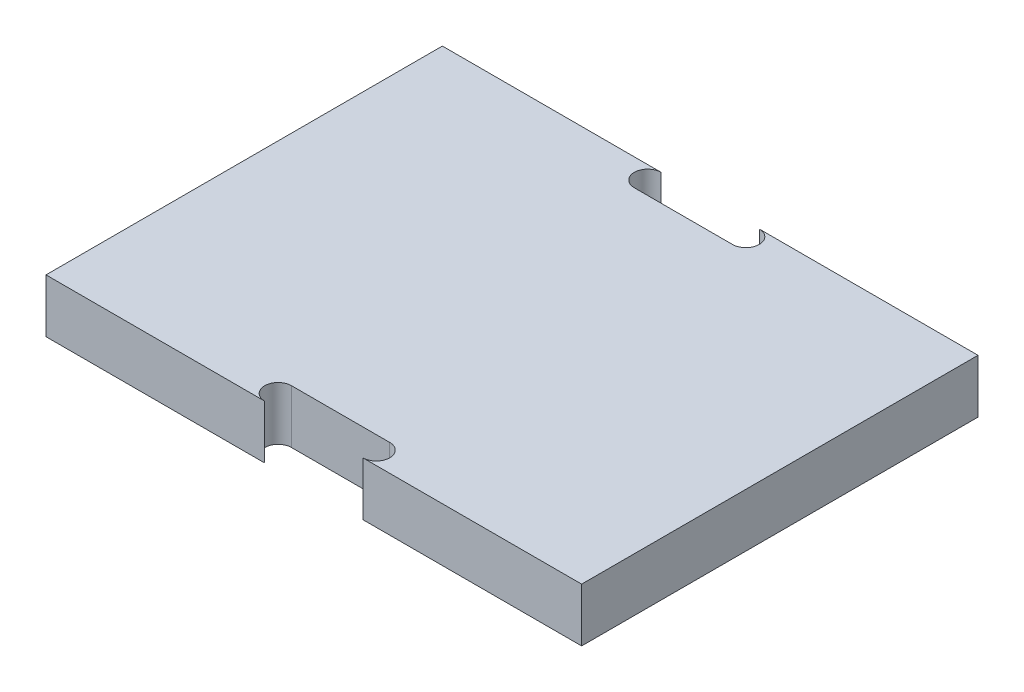
ISO-10303-21;
HEADER;
FILE_DESCRIPTION(('STEP AP214'),'2;1');
FILE_NAME('part.step','',(''),(''),'','','');
FILE_SCHEMA(('AUTOMOTIVE_DESIGN { 1 0 10303 214 1 1 1 1 }'));
ENDSEC;
DATA;
#1=APPLICATION_CONTEXT('core data for automotive mechanical design processes');
#2=APPLICATION_PROTOCOL_DEFINITION('international standard','automotive_design',2000,#1);
#3=PRODUCT_CONTEXT('',#1,'mechanical');
#4=PRODUCT('Part','Part','',(#3));
#5=PRODUCT_RELATED_PRODUCT_CATEGORY('part','',(#4));
#6=PRODUCT_DEFINITION_FORMATION('','',#4);
#7=PRODUCT_DEFINITION_CONTEXT('part definition',#1,'design');
#8=PRODUCT_DEFINITION('design','',#6,#7);
#9=PRODUCT_DEFINITION_SHAPE('','',#8);
#10=(LENGTH_UNIT() NAMED_UNIT(*) SI_UNIT(.MILLI.,.METRE.));
#11=(NAMED_UNIT(*) PLANE_ANGLE_UNIT() SI_UNIT($,.RADIAN.));
#12=(NAMED_UNIT(*) SI_UNIT($,.STERADIAN.) SOLID_ANGLE_UNIT());
#13=UNCERTAINTY_MEASURE_WITH_UNIT(LENGTH_MEASURE(1.E-05),#10,'distance_accuracy_value','');
#14=(GEOMETRIC_REPRESENTATION_CONTEXT(3) GLOBAL_UNCERTAINTY_ASSIGNED_CONTEXT((#13)) GLOBAL_UNIT_ASSIGNED_CONTEXT((#10,
#11,#12)) REPRESENTATION_CONTEXT('',''));
#15=CARTESIAN_POINT('',(0.,0.,0.));
#16=DIRECTION('',(0.,0.,1.));
#17=DIRECTION('',(1.,0.,0.));
#18=AXIS2_PLACEMENT_3D('',#15,#16,#17);
#19=CARTESIAN_POINT('',(-30.,6.,22.2));
#20=DIRECTION('',(0.,0.,-1.));
#21=DIRECTION('',(-1.,0.,0.));
#22=AXIS2_PLACEMENT_3D('',#19,#20,#21);
#23=PLANE('',#22);
#24=DIRECTION('',(1.,0.,0.));
#25=VECTOR('',#24,1.);
#26=CARTESIAN_POINT('',(-30.,0.,22.2));
#27=LINE('',#26,#25);
#28=CARTESIAN_POINT('',(-30.,0.,22.2));
#29=VERTEX_POINT('',#28);
#30=CARTESIAN_POINT('',(-5.5,0.,22.2));
#31=VERTEX_POINT('',#30);
#32=EDGE_CURVE('E171',#29,#31,#27,.T.);
#33=ORIENTED_EDGE('',*,*,#32,.T.);
#34=DIRECTION('',(0.,-1.,0.));
#35=VECTOR('',#34,1.);
#36=CARTESIAN_POINT('',(-5.5,6.,22.2));
#37=LINE('',#36,#35);
#38=CARTESIAN_POINT('',(-5.5,6.,22.2));
#39=VERTEX_POINT('',#38);
#40=EDGE_CURVE('E52',#39,#31,#37,.T.);
#41=ORIENTED_EDGE('',*,*,#40,.F.);
#42=DIRECTION('',(1.,0.,0.));
#43=VECTOR('',#42,1.);
#44=CARTESIAN_POINT('',(-30.,6.,22.2));
#45=LINE('',#44,#43);
#46=CARTESIAN_POINT('',(-30.,6.,22.2));
#47=VERTEX_POINT('',#46);
#48=EDGE_CURVE('E116',#47,#39,#45,.T.);
#49=ORIENTED_EDGE('',*,*,#48,.F.);
#50=DIRECTION('',(0.,-1.,0.));
#51=VECTOR('',#50,1.);
#52=CARTESIAN_POINT('',(-30.,6.,22.2));
#53=LINE('',#52,#51);
#54=EDGE_CURVE('E11',#47,#29,#53,.T.);
#55=ORIENTED_EDGE('',*,*,#54,.T.);
#56=EDGE_LOOP('',(#33,#41,#49,#55));
#57=FACE_BOUND('',#56,.T.);
#58=ADVANCED_FACE('F43',(#57),#23,.F.);
#59=CARTESIAN_POINT('',(-5.5,6.,20.7));
#60=DIRECTION('',(0.,-1.,0.));
#61=DIRECTION('',(0.,0.,-1.));
#62=AXIS2_PLACEMENT_3D('',#59,#60,#61);
#63=CYLINDRICAL_SURFACE('',#62,1.5);
#64=CARTESIAN_POINT('',(-5.5,0.,20.7));
#65=DIRECTION('',(0.,-1.,0.));
#66=DIRECTION('',(0.,0.,1.));
#67=AXIS2_PLACEMENT_3D('',#64,#65,#66);
#68=CIRCLE('',#67,1.5);
#69=CARTESIAN_POINT('',(-5.5,0.,19.2));
#70=VERTEX_POINT('',#69);
#71=EDGE_CURVE('E174',#31,#70,#68,.T.);
#72=ORIENTED_EDGE('',*,*,#71,.T.);
#73=DIRECTION('',(0.,-1.,0.));
#74=VECTOR('',#73,1.);
#75=CARTESIAN_POINT('',(-5.5,6.,19.2));
#76=LINE('',#75,#74);
#77=CARTESIAN_POINT('',(-5.5,6.,19.2));
#78=VERTEX_POINT('',#77);
#79=EDGE_CURVE('E233',#78,#70,#76,.T.);
#80=ORIENTED_EDGE('',*,*,#79,.F.);
#81=CARTESIAN_POINT('',(-5.5,6.,20.7));
#82=DIRECTION('',(0.,-1.,0.));
#83=DIRECTION('',(0.,0.,1.));
#84=AXIS2_PLACEMENT_3D('',#81,#82,#83);
#85=CIRCLE('',#84,1.5);
#86=EDGE_CURVE('E243',#39,#78,#85,.T.);
#87=ORIENTED_EDGE('',*,*,#86,.F.);
#88=ORIENTED_EDGE('',*,*,#40,.T.);
#89=EDGE_LOOP('',(#72,#80,#87,#88));
#90=FACE_BOUND('',#89,.T.);
#91=ADVANCED_FACE('F241',(#90),#63,.F.);
#92=CARTESIAN_POINT('',(0.,6.,19.2));
#93=DIRECTION('',(0.,0.,-1.));
#94=DIRECTION('',(-1.,0.,0.));
#95=AXIS2_PLACEMENT_3D('',#92,#93,#94);
#96=PLANE('',#95);
#97=DIRECTION('',(1.,0.,0.));
#98=VECTOR('',#97,1.);
#99=CARTESIAN_POINT('',(0.,0.,19.2));
#100=LINE('',#99,#98);
#101=CARTESIAN_POINT('',(5.5,0.,19.2));
#102=VERTEX_POINT('',#101);
#103=EDGE_CURVE('E178',#70,#102,#100,.T.);
#104=ORIENTED_EDGE('',*,*,#103,.T.);
#105=DIRECTION('',(0.,-1.,0.));
#106=VECTOR('',#105,1.);
#107=CARTESIAN_POINT('',(5.5,6.,19.2));
#108=LINE('',#107,#106);
#109=CARTESIAN_POINT('',(5.5,6.,19.2));
#110=VERTEX_POINT('',#109);
#111=EDGE_CURVE('E229',#110,#102,#108,.T.);
#112=ORIENTED_EDGE('',*,*,#111,.F.);
#113=DIRECTION('',(1.,0.,0.));
#114=VECTOR('',#113,1.);
#115=CARTESIAN_POINT('',(0.,6.,19.2));
#116=LINE('',#115,#114);
#117=EDGE_CURVE('E262',#78,#110,#116,.T.);
#118=ORIENTED_EDGE('',*,*,#117,.F.);
#119=ORIENTED_EDGE('',*,*,#79,.T.);
#120=EDGE_LOOP('',(#104,#112,#118,#119));
#121=FACE_BOUND('',#120,.T.);
#122=ADVANCED_FACE('F252',(#121),#96,.F.);
#123=CARTESIAN_POINT('',(5.5,6.,20.7));
#124=DIRECTION('',(0.,-1.,0.));
#125=DIRECTION('',(0.,0.,-1.));
#126=AXIS2_PLACEMENT_3D('',#123,#124,#125);
#127=CYLINDRICAL_SURFACE('',#126,1.5);
#128=CARTESIAN_POINT('',(5.5,0.,20.7));
#129=DIRECTION('',(0.,-1.,0.));
#130=DIRECTION('',(0.,0.,-1.));
#131=AXIS2_PLACEMENT_3D('',#128,#129,#130);
#132=CIRCLE('',#131,1.5);
#133=CARTESIAN_POINT('',(5.5,0.,22.2));
#134=VERTEX_POINT('',#133);
#135=EDGE_CURVE('E181',#102,#134,#132,.T.);
#136=ORIENTED_EDGE('',*,*,#135,.T.);
#137=DIRECTION('',(0.,-1.,0.));
#138=VECTOR('',#137,1.);
#139=CARTESIAN_POINT('',(5.5,6.,22.2));
#140=LINE('',#139,#138);
#141=CARTESIAN_POINT('',(5.5,6.,22.2));
#142=VERTEX_POINT('',#141);
#143=EDGE_CURVE('E225',#142,#134,#140,.T.);
#144=ORIENTED_EDGE('',*,*,#143,.F.);
#145=CARTESIAN_POINT('',(5.5,6.,20.7));
#146=DIRECTION('',(0.,-1.,0.));
#147=DIRECTION('',(0.,0.,-1.));
#148=AXIS2_PLACEMENT_3D('',#145,#146,#147);
#149=CIRCLE('',#148,1.5);
#150=EDGE_CURVE('E258',#110,#142,#149,.T.);
#151=ORIENTED_EDGE('',*,*,#150,.F.);
#152=ORIENTED_EDGE('',*,*,#111,.T.);
#153=EDGE_LOOP('',(#136,#144,#151,#152));
#154=FACE_BOUND('',#153,.T.);
#155=ADVANCED_FACE('F256',(#154),#127,.F.);
#156=CARTESIAN_POINT('',(30.,6.,22.2));
#157=DIRECTION('',(0.,0.,-1.));
#158=DIRECTION('',(-1.,0.,0.));
#159=AXIS2_PLACEMENT_3D('',#156,#157,#158);
#160=PLANE('',#159);
#161=DIRECTION('',(1.,0.,0.));
#162=VECTOR('',#161,1.);
#163=CARTESIAN_POINT('',(30.,0.,22.2));
#164=LINE('',#163,#162);
#165=CARTESIAN_POINT('',(30.,0.,22.2));
#166=VERTEX_POINT('',#165);
#167=EDGE_CURVE('E184',#134,#166,#164,.T.);
#168=ORIENTED_EDGE('',*,*,#167,.T.);
#169=DIRECTION('',(0.,-1.,0.));
#170=VECTOR('',#169,1.);
#171=CARTESIAN_POINT('',(30.,6.,22.2));
#172=LINE('',#171,#170);
#173=CARTESIAN_POINT('',(30.,6.,22.2));
#174=VERTEX_POINT('',#173);
#175=EDGE_CURVE('E221',#174,#166,#172,.T.);
#176=ORIENTED_EDGE('',*,*,#175,.F.);
#177=DIRECTION('',(1.,0.,0.));
#178=VECTOR('',#177,1.);
#179=CARTESIAN_POINT('',(30.,6.,22.2));
#180=LINE('',#179,#178);
#181=EDGE_CURVE('E261',#142,#174,#180,.T.);
#182=ORIENTED_EDGE('',*,*,#181,.F.);
#183=ORIENTED_EDGE('',*,*,#143,.T.);
#184=EDGE_LOOP('',(#168,#176,#182,#183));
#185=FACE_BOUND('',#184,.T.);
#186=ADVANCED_FACE('F312',(#185),#160,.F.);
#187=CARTESIAN_POINT('',(30.,6.,0.));
#188=DIRECTION('',(-1.,0.,0.));
#189=DIRECTION('',(0.,0.,1.));
#190=AXIS2_PLACEMENT_3D('',#187,#188,#189);
#191=PLANE('',#190);
#192=DIRECTION('',(0.,0.,-1.));
#193=VECTOR('',#192,1.);
#194=CARTESIAN_POINT('',(30.,0.,0.));
#195=LINE('',#194,#193);
#196=CARTESIAN_POINT('',(30.,0.,-22.2));
#197=VERTEX_POINT('',#196);
#198=EDGE_CURVE('E188',#166,#197,#195,.T.);
#199=ORIENTED_EDGE('',*,*,#198,.T.);
#200=DIRECTION('',(0.,-1.,0.));
#201=VECTOR('',#200,1.);
#202=CARTESIAN_POINT('',(30.,6.,-22.2));
#203=LINE('',#202,#201);
#204=CARTESIAN_POINT('',(30.,6.,-22.2));
#205=VERTEX_POINT('',#204);
#206=EDGE_CURVE('E217',#205,#197,#203,.T.);
#207=ORIENTED_EDGE('',*,*,#206,.F.);
#208=DIRECTION('',(0.,0.,-1.));
#209=VECTOR('',#208,1.);
#210=CARTESIAN_POINT('',(30.,6.,22.2));
#211=LINE('',#210,#209);
#212=EDGE_CURVE('E266',#174,#205,#211,.T.);
#213=ORIENTED_EDGE('',*,*,#212,.F.);
#214=ORIENTED_EDGE('',*,*,#175,.T.);
#215=EDGE_LOOP('',(#199,#207,#213,#214));
#216=FACE_BOUND('',#215,.T.);
#217=ADVANCED_FACE('F315',(#216),#191,.F.);
#218=CARTESIAN_POINT('',(30.,6.,-22.2));
#219=DIRECTION('',(0.,0.,1.));
#220=DIRECTION('',(1.,0.,0.));
#221=AXIS2_PLACEMENT_3D('',#218,#219,#220);
#222=PLANE('',#221);
#223=DIRECTION('',(-1.,0.,0.));
#224=VECTOR('',#223,1.);
#225=CARTESIAN_POINT('',(30.,0.,-22.2));
#226=LINE('',#225,#224);
#227=CARTESIAN_POINT('',(5.5,0.,-22.2));
#228=VERTEX_POINT('',#227);
#229=EDGE_CURVE('E191',#197,#228,#226,.T.);
#230=ORIENTED_EDGE('',*,*,#229,.T.);
#231=DIRECTION('',(0.,-1.,0.));
#232=VECTOR('',#231,1.);
#233=CARTESIAN_POINT('',(5.5,6.,-22.2));
#234=LINE('',#233,#232);
#235=CARTESIAN_POINT('',(5.5,6.,-22.2));
#236=VERTEX_POINT('',#235);
#237=EDGE_CURVE('E213',#236,#228,#234,.T.);
#238=ORIENTED_EDGE('',*,*,#237,.F.);
#239=DIRECTION('',(-1.,0.,0.));
#240=VECTOR('',#239,1.);
#241=CARTESIAN_POINT('',(30.,6.,-22.2));
#242=LINE('',#241,#240);
#243=EDGE_CURVE('E273',#205,#236,#242,.T.);
#244=ORIENTED_EDGE('',*,*,#243,.F.);
#245=ORIENTED_EDGE('',*,*,#206,.T.);
#246=EDGE_LOOP('',(#230,#238,#244,#245));
#247=FACE_BOUND('',#246,.T.);
#248=ADVANCED_FACE('F281',(#247),#222,.F.);
#249=CARTESIAN_POINT('',(5.5,6.,-20.7));
#250=DIRECTION('',(0.,-1.,0.));
#251=DIRECTION('',(0.,0.,-1.));
#252=AXIS2_PLACEMENT_3D('',#249,#250,#251);
#253=CYLINDRICAL_SURFACE('',#252,1.5);
#254=CARTESIAN_POINT('',(5.5,0.,-20.7));
#255=DIRECTION('',(0.,-1.,0.));
#256=DIRECTION('',(0.,0.,-1.));
#257=AXIS2_PLACEMENT_3D('',#254,#255,#256);
#258=CIRCLE('',#257,1.5);
#259=CARTESIAN_POINT('',(5.5,0.,-19.2));
#260=VERTEX_POINT('',#259);
#261=EDGE_CURVE('E194',#228,#260,#258,.T.);
#262=ORIENTED_EDGE('',*,*,#261,.T.);
#263=DIRECTION('',(0.,-1.,0.));
#264=VECTOR('',#263,1.);
#265=CARTESIAN_POINT('',(5.5,6.,-19.2));
#266=LINE('',#265,#264);
#267=CARTESIAN_POINT('',(5.5,6.,-19.2));
#268=VERTEX_POINT('',#267);
#269=EDGE_CURVE('E158',#268,#260,#266,.T.);
#270=ORIENTED_EDGE('',*,*,#269,.F.);
#271=CARTESIAN_POINT('',(5.5,6.,-20.7));
#272=DIRECTION('',(0.,-1.,0.));
#273=DIRECTION('',(0.,0.,-1.));
#274=AXIS2_PLACEMENT_3D('',#271,#272,#273);
#275=CIRCLE('',#274,1.5);
#276=EDGE_CURVE('E148',#236,#268,#275,.T.);
#277=ORIENTED_EDGE('',*,*,#276,.F.);
#278=ORIENTED_EDGE('',*,*,#237,.T.);
#279=EDGE_LOOP('',(#262,#270,#277,#278));
#280=FACE_BOUND('',#279,.T.);
#281=ADVANCED_FACE('F285',(#280),#253,.F.);
#282=CARTESIAN_POINT('',(0.,6.,-19.2));
#283=DIRECTION('',(0.,0.,1.));
#284=DIRECTION('',(1.,0.,0.));
#285=AXIS2_PLACEMENT_3D('',#282,#283,#284);
#286=PLANE('',#285);
#287=DIRECTION('',(-1.,0.,0.));
#288=VECTOR('',#287,1.);
#289=CARTESIAN_POINT('',(0.,0.,-19.2));
#290=LINE('',#289,#288);
#291=CARTESIAN_POINT('',(-5.5,0.,-19.2));
#292=VERTEX_POINT('',#291);
#293=EDGE_CURVE('E156',#260,#292,#290,.T.);
#294=ORIENTED_EDGE('',*,*,#293,.T.);
#295=DIRECTION('',(0.,-1.,0.));
#296=VECTOR('',#295,1.);
#297=CARTESIAN_POINT('',(-5.5,6.,-19.2));
#298=LINE('',#297,#296);
#299=CARTESIAN_POINT('',(-5.5,6.,-19.2));
#300=VERTEX_POINT('',#299);
#301=EDGE_CURVE('E154',#300,#292,#298,.T.);
#302=ORIENTED_EDGE('',*,*,#301,.F.);
#303=DIRECTION('',(-1.,0.,0.));
#304=VECTOR('',#303,1.);
#305=CARTESIAN_POINT('',(0.,6.,-19.2));
#306=LINE('',#305,#304);
#307=EDGE_CURVE('E142',#268,#300,#306,.T.);
#308=ORIENTED_EDGE('',*,*,#307,.F.);
#309=ORIENTED_EDGE('',*,*,#269,.T.);
#310=EDGE_LOOP('',(#294,#302,#308,#309));
#311=FACE_BOUND('',#310,.T.);
#312=ADVANCED_FACE('F155',(#311),#286,.F.);
#313=CARTESIAN_POINT('',(-5.5,6.,-20.7));
#314=DIRECTION('',(0.,-1.,0.));
#315=DIRECTION('',(0.,0.,-1.));
#316=AXIS2_PLACEMENT_3D('',#313,#314,#315);
#317=CYLINDRICAL_SURFACE('',#316,1.5);
#318=CARTESIAN_POINT('',(-5.5,0.,-20.7));
#319=DIRECTION('',(0.,-1.,0.));
#320=DIRECTION('',(0.,0.,1.));
#321=AXIS2_PLACEMENT_3D('',#318,#319,#320);
#322=CIRCLE('',#321,1.5);
#323=CARTESIAN_POINT('',(-5.5,0.,-22.2));
#324=VERTEX_POINT('',#323);
#325=EDGE_CURVE('E102',#292,#324,#322,.T.);
#326=ORIENTED_EDGE('',*,*,#325,.T.);
#327=DIRECTION('',(0.,-1.,0.));
#328=VECTOR('',#327,1.);
#329=CARTESIAN_POINT('',(-5.5,6.,-22.2));
#330=LINE('',#329,#328);
#331=CARTESIAN_POINT('',(-5.5,6.,-22.2));
#332=VERTEX_POINT('',#331);
#333=EDGE_CURVE('E159',#332,#324,#330,.T.);
#334=ORIENTED_EDGE('',*,*,#333,.F.);
#335=CARTESIAN_POINT('',(-5.5,6.,-20.7));
#336=DIRECTION('',(0.,-1.,0.));
#337=DIRECTION('',(0.,0.,1.));
#338=AXIS2_PLACEMENT_3D('',#335,#336,#337);
#339=CIRCLE('',#338,1.5);
#340=EDGE_CURVE('E146',#300,#332,#339,.T.);
#341=ORIENTED_EDGE('',*,*,#340,.F.);
#342=ORIENTED_EDGE('',*,*,#301,.T.);
#343=EDGE_LOOP('',(#326,#334,#341,#342));
#344=FACE_BOUND('',#343,.T.);
#345=ADVANCED_FACE('F161',(#344),#317,.F.);
#346=CARTESIAN_POINT('',(-30.,6.,-22.2));
#347=DIRECTION('',(0.,0.,1.));
#348=DIRECTION('',(1.,0.,0.));
#349=AXIS2_PLACEMENT_3D('',#346,#347,#348);
#350=PLANE('',#349);
#351=DIRECTION('',(-1.,0.,0.));
#352=VECTOR('',#351,1.);
#353=CARTESIAN_POINT('',(-30.,0.,-22.2));
#354=LINE('',#353,#352);
#355=CARTESIAN_POINT('',(-30.,0.,-22.2));
#356=VERTEX_POINT('',#355);
#357=EDGE_CURVE('E109',#324,#356,#354,.T.);
#358=ORIENTED_EDGE('',*,*,#357,.T.);
#359=DIRECTION('',(0.,-1.,0.));
#360=VECTOR('',#359,1.);
#361=CARTESIAN_POINT('',(-30.,6.,-22.2));
#362=LINE('',#361,#360);
#363=CARTESIAN_POINT('',(-30.,6.,-22.2));
#364=VERTEX_POINT('',#363);
#365=EDGE_CURVE('E167',#364,#356,#362,.T.);
#366=ORIENTED_EDGE('',*,*,#365,.F.);
#367=DIRECTION('',(-1.,0.,0.));
#368=VECTOR('',#367,1.);
#369=CARTESIAN_POINT('',(-30.,6.,-22.2));
#370=LINE('',#369,#368);
#371=EDGE_CURVE('E164',#332,#364,#370,.T.);
#372=ORIENTED_EDGE('',*,*,#371,.F.);
#373=ORIENTED_EDGE('',*,*,#333,.T.);
#374=EDGE_LOOP('',(#358,#366,#372,#373));
#375=FACE_BOUND('',#374,.T.);
#376=ADVANCED_FACE('F287',(#375),#350,.F.);
#377=CARTESIAN_POINT('',(-30.,6.,0.));
#378=DIRECTION('',(1.,0.,0.));
#379=DIRECTION('',(0.,0.,-1.));
#380=AXIS2_PLACEMENT_3D('',#377,#378,#379);
#381=PLANE('',#380);
#382=DIRECTION('',(0.,0.,1.));
#383=VECTOR('',#382,1.);
#384=CARTESIAN_POINT('',(-30.,0.,0.));
#385=LINE('',#384,#383);
#386=EDGE_CURVE('E204',#356,#29,#385,.T.);
#387=ORIENTED_EDGE('',*,*,#386,.T.);
#388=ORIENTED_EDGE('',*,*,#54,.F.);
#389=DIRECTION('',(0.,0.,1.));
#390=VECTOR('',#389,1.);
#391=CARTESIAN_POINT('',(-30.,6.,0.));
#392=LINE('',#391,#390);
#393=EDGE_CURVE('E60',#364,#47,#392,.T.);
#394=ORIENTED_EDGE('',*,*,#393,.F.);
#395=ORIENTED_EDGE('',*,*,#365,.T.);
#396=EDGE_LOOP('',(#387,#388,#394,#395));
#397=FACE_BOUND('',#396,.T.);
#398=ADVANCED_FACE('F286',(#397),#381,.F.);
#399=CARTESIAN_POINT('',(-5.5,6.,20.7));
#400=DIRECTION('',(0.,1.,0.));
#401=DIRECTION('',(0.,0.,1.));
#402=AXIS2_PLACEMENT_3D('',#399,#400,#401);
#403=PLANE('',#402);
#404=ORIENTED_EDGE('',*,*,#393,.T.);
#405=ORIENTED_EDGE('',*,*,#48,.T.);
#406=ORIENTED_EDGE('',*,*,#86,.T.);
#407=ORIENTED_EDGE('',*,*,#117,.T.);
#408=ORIENTED_EDGE('',*,*,#150,.T.);
#409=ORIENTED_EDGE('',*,*,#181,.T.);
#410=ORIENTED_EDGE('',*,*,#212,.T.);
#411=ORIENTED_EDGE('',*,*,#243,.T.);
#412=ORIENTED_EDGE('',*,*,#276,.T.);
#413=ORIENTED_EDGE('',*,*,#307,.T.);
#414=ORIENTED_EDGE('',*,*,#340,.T.);
#415=ORIENTED_EDGE('',*,*,#371,.T.);
#416=EDGE_LOOP('',(#404,#405,#406,#407,#408,#409,#410,#411,#412,#413,#414,#415));
#417=FACE_BOUND('',#416,.T.);
#418=ADVANCED_FACE('F144',(#417),#403,.T.);
#419=CARTESIAN_POINT('',(-5.5,0.,20.7));
#420=DIRECTION('',(0.,1.,0.));
#421=DIRECTION('',(0.,0.,1.));
#422=AXIS2_PLACEMENT_3D('',#419,#420,#421);
#423=PLANE('',#422);
#424=ORIENTED_EDGE('',*,*,#32,.F.);
#425=ORIENTED_EDGE('',*,*,#386,.F.);
#426=ORIENTED_EDGE('',*,*,#357,.F.);
#427=ORIENTED_EDGE('',*,*,#325,.F.);
#428=ORIENTED_EDGE('',*,*,#293,.F.);
#429=ORIENTED_EDGE('',*,*,#261,.F.);
#430=ORIENTED_EDGE('',*,*,#229,.F.);
#431=ORIENTED_EDGE('',*,*,#198,.F.);
#432=ORIENTED_EDGE('',*,*,#167,.F.);
#433=ORIENTED_EDGE('',*,*,#135,.F.);
#434=ORIENTED_EDGE('',*,*,#103,.F.);
#435=ORIENTED_EDGE('',*,*,#71,.F.);
#436=EDGE_LOOP('',(#424,#425,#426,#427,#428,#429,#430,#431,#432,#433,#434,#435));
#437=FACE_BOUND('',#436,.T.);
#438=ADVANCED_FACE('F246',(#437),#423,.F.);
#439=CLOSED_SHELL('',(#58,#91,#122,#155,#186,#217,#248,#281,#312,#345,#376,#398,#418,#438));
#440=MANIFOLD_SOLID_BREP('B2',#439);
#441=ADVANCED_BREP_SHAPE_REPRESENTATION('',(#18,#440),#14);
#442=SHAPE_DEFINITION_REPRESENTATION(#9,#441);
ENDSEC;
END-ISO-10303-21;
